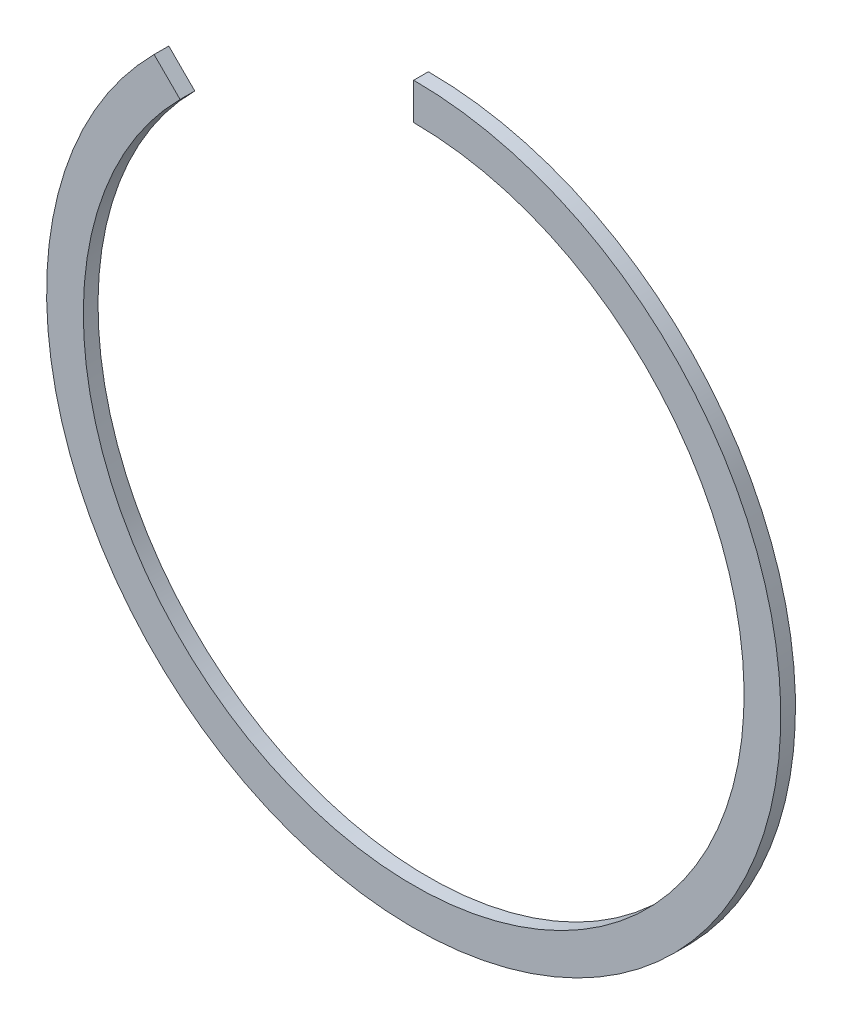
ISO-10303-21;
HEADER;
FILE_DESCRIPTION(('STEP AP214'),'2;1');
FILE_NAME('part.step','',(''),(''),'','','');
FILE_SCHEMA(('AUTOMOTIVE_DESIGN { 1 0 10303 214 1 1 1 1 }'));
ENDSEC;
DATA;
#1=APPLICATION_CONTEXT('core data for automotive mechanical design processes');
#2=APPLICATION_PROTOCOL_DEFINITION('international standard','automotive_design',2000,#1);
#3=PRODUCT_CONTEXT('',#1,'mechanical');
#4=PRODUCT('Part','Part','',(#3));
#5=PRODUCT_RELATED_PRODUCT_CATEGORY('part','',(#4));
#6=PRODUCT_DEFINITION_FORMATION('','',#4);
#7=PRODUCT_DEFINITION_CONTEXT('part definition',#1,'design');
#8=PRODUCT_DEFINITION('design','',#6,#7);
#9=PRODUCT_DEFINITION_SHAPE('','',#8);
#10=(LENGTH_UNIT() NAMED_UNIT(*) SI_UNIT(.MILLI.,.METRE.));
#11=(NAMED_UNIT(*) PLANE_ANGLE_UNIT() SI_UNIT($,.RADIAN.));
#12=(NAMED_UNIT(*) SI_UNIT($,.STERADIAN.) SOLID_ANGLE_UNIT());
#13=UNCERTAINTY_MEASURE_WITH_UNIT(LENGTH_MEASURE(1.E-05),#10,'distance_accuracy_value','');
#14=(GEOMETRIC_REPRESENTATION_CONTEXT(3) GLOBAL_UNCERTAINTY_ASSIGNED_CONTEXT((#13)) GLOBAL_UNIT_ASSIGNED_CONTEXT((#10,
#11,#12)) REPRESENTATION_CONTEXT('',''));
#15=CARTESIAN_POINT('',(0.,0.,0.));
#16=DIRECTION('',(0.,0.,1.));
#17=DIRECTION('',(1.,0.,0.));
#18=AXIS2_PLACEMENT_3D('',#15,#16,#17);
#19=CARTESIAN_POINT('',(0.,0.,1.));
#20=DIRECTION('',(0.,0.,-1.));
#21=DIRECTION('',(-1.,0.,0.));
#22=AXIS2_PLACEMENT_3D('',#19,#20,#21);
#23=CYLINDRICAL_SURFACE('',#22,22.5);
#24=CARTESIAN_POINT('',(0.,0.,0.));
#25=DIRECTION('',(0.,0.,1.));
#26=DIRECTION('',(1.,0.,0.));
#27=AXIS2_PLACEMENT_3D('',#24,#25,#26);
#28=CIRCLE('',#27,22.5);
#29=CARTESIAN_POINT('',(-15.9099025766973,15.9099025766973,0.));
#30=VERTEX_POINT('',#29);
#31=CARTESIAN_POINT('',(0.,22.5,0.));
#32=VERTEX_POINT('',#31);
#33=EDGE_CURVE('E112',#30,#32,#28,.T.);
#34=ORIENTED_EDGE('',*,*,#33,.F.);
#35=DIRECTION('',(0.,0.,-1.));
#36=VECTOR('',#35,1.);
#37=CARTESIAN_POINT('',(-15.9099025766973,15.9099025766973,1.));
#38=LINE('',#37,#36);
#39=CARTESIAN_POINT('',(-15.9099025766973,15.9099025766973,1.));
#40=VERTEX_POINT('',#39);
#41=EDGE_CURVE('E11',#40,#30,#38,.T.);
#42=ORIENTED_EDGE('',*,*,#41,.F.);
#43=CARTESIAN_POINT('',(0.,0.,1.));
#44=DIRECTION('',(0.,0.,1.));
#45=DIRECTION('',(1.,0.,0.));
#46=AXIS2_PLACEMENT_3D('',#43,#44,#45);
#47=CIRCLE('',#46,22.5);
#48=CARTESIAN_POINT('',(0.,22.5,1.));
#49=VERTEX_POINT('',#48);
#50=EDGE_CURVE('E103',#40,#49,#47,.T.);
#51=ORIENTED_EDGE('',*,*,#50,.T.);
#52=DIRECTION('',(0.,0.,-1.));
#53=VECTOR('',#52,1.);
#54=CARTESIAN_POINT('',(0.,22.5,1.));
#55=LINE('',#54,#53);
#56=EDGE_CURVE('E59',#49,#32,#55,.T.);
#57=ORIENTED_EDGE('',*,*,#56,.T.);
#58=EDGE_LOOP('',(#34,#42,#51,#57));
#59=FACE_BOUND('',#58,.T.);
#60=ADVANCED_FACE('F42',(#59),#23,.F.);
#61=CARTESIAN_POINT('',(0.,0.,1.));
#62=DIRECTION('',(0.707106781186547,0.707106781186547,0.));
#63=DIRECTION('',(-0.707106781186548,0.707106781186548,0.));
#64=AXIS2_PLACEMENT_3D('',#61,#62,#63);
#65=PLANE('',#64);
#66=DIRECTION('',(0.707106781186548,-0.707106781186548,0.));
#67=VECTOR('',#66,1.);
#68=CARTESIAN_POINT('',(0.,0.,0.));
#69=LINE('',#68,#67);
#70=CARTESIAN_POINT('',(-17.6776695296637,17.6776695296637,0.));
#71=VERTEX_POINT('',#70);
#72=EDGE_CURVE('E91',#71,#30,#69,.T.);
#73=ORIENTED_EDGE('',*,*,#72,.F.);
#74=DIRECTION('',(0.,0.,-1.));
#75=VECTOR('',#74,1.);
#76=CARTESIAN_POINT('',(-17.6776695296637,17.6776695296637,1.));
#77=LINE('',#76,#75);
#78=CARTESIAN_POINT('',(-17.6776695296637,17.6776695296637,1.));
#79=VERTEX_POINT('',#78);
#80=EDGE_CURVE('E51',#79,#71,#77,.T.);
#81=ORIENTED_EDGE('',*,*,#80,.F.);
#82=DIRECTION('',(0.707106781186548,-0.707106781186548,0.));
#83=VECTOR('',#82,1.);
#84=CARTESIAN_POINT('',(0.,0.,1.));
#85=LINE('',#84,#83);
#86=EDGE_CURVE('E89',#79,#40,#85,.T.);
#87=ORIENTED_EDGE('',*,*,#86,.T.);
#88=ORIENTED_EDGE('',*,*,#41,.T.);
#89=EDGE_LOOP('',(#73,#81,#87,#88));
#90=FACE_BOUND('',#89,.T.);
#91=ADVANCED_FACE('F87',(#90),#65,.T.);
#92=CARTESIAN_POINT('',(0.,0.,1.));
#93=DIRECTION('',(0.,0.,-1.));
#94=DIRECTION('',(-1.,0.,0.));
#95=AXIS2_PLACEMENT_3D('',#92,#93,#94);
#96=CYLINDRICAL_SURFACE('',#95,25.);
#97=CARTESIAN_POINT('',(0.,0.,0.));
#98=DIRECTION('',(0.,0.,1.));
#99=DIRECTION('',(1.,0.,0.));
#100=AXIS2_PLACEMENT_3D('',#97,#98,#99);
#101=CIRCLE('',#100,25.);
#102=CARTESIAN_POINT('',(0.,25.,0.));
#103=VERTEX_POINT('',#102);
#104=EDGE_CURVE('E117',#71,#103,#101,.T.);
#105=ORIENTED_EDGE('',*,*,#104,.T.);
#106=DIRECTION('',(0.,0.,-1.));
#107=VECTOR('',#106,1.);
#108=CARTESIAN_POINT('',(0.,25.,1.));
#109=LINE('',#108,#107);
#110=CARTESIAN_POINT('',(0.,25.,1.));
#111=VERTEX_POINT('',#110);
#112=EDGE_CURVE('E73',#111,#103,#109,.T.);
#113=ORIENTED_EDGE('',*,*,#112,.F.);
#114=CARTESIAN_POINT('',(0.,0.,1.));
#115=DIRECTION('',(0.,0.,1.));
#116=DIRECTION('',(1.,0.,0.));
#117=AXIS2_PLACEMENT_3D('',#114,#115,#116);
#118=CIRCLE('',#117,25.);
#119=EDGE_CURVE('E95',#79,#111,#118,.T.);
#120=ORIENTED_EDGE('',*,*,#119,.F.);
#121=ORIENTED_EDGE('',*,*,#80,.T.);
#122=EDGE_LOOP('',(#105,#113,#120,#121));
#123=FACE_BOUND('',#122,.T.);
#124=ADVANCED_FACE('F96',(#123),#96,.T.);
#125=CARTESIAN_POINT('',(0.,0.,1.));
#126=DIRECTION('',(-1.,0.,0.));
#127=DIRECTION('',(0.,0.,1.));
#128=AXIS2_PLACEMENT_3D('',#125,#126,#127);
#129=PLANE('',#128);
#130=DIRECTION('',(0.,1.,0.));
#131=VECTOR('',#130,1.);
#132=CARTESIAN_POINT('',(0.,0.,0.));
#133=LINE('',#132,#131);
#134=EDGE_CURVE('E107',#32,#103,#133,.T.);
#135=ORIENTED_EDGE('',*,*,#134,.F.);
#136=ORIENTED_EDGE('',*,*,#56,.F.);
#137=DIRECTION('',(0.,1.,0.));
#138=VECTOR('',#137,1.);
#139=CARTESIAN_POINT('',(0.,0.,1.));
#140=LINE('',#139,#138);
#141=EDGE_CURVE('E100',#49,#111,#140,.T.);
#142=ORIENTED_EDGE('',*,*,#141,.T.);
#143=ORIENTED_EDGE('',*,*,#112,.T.);
#144=EDGE_LOOP('',(#135,#136,#142,#143));
#145=FACE_BOUND('',#144,.T.);
#146=ADVANCED_FACE('F128',(#145),#129,.T.);
#147=CARTESIAN_POINT('',(0.,0.,1.));
#148=DIRECTION('',(0.,0.,1.));
#149=DIRECTION('',(1.,0.,0.));
#150=AXIS2_PLACEMENT_3D('',#147,#148,#149);
#151=PLANE('',#150);
#152=ORIENTED_EDGE('',*,*,#50,.F.);
#153=ORIENTED_EDGE('',*,*,#86,.F.);
#154=ORIENTED_EDGE('',*,*,#119,.T.);
#155=ORIENTED_EDGE('',*,*,#141,.F.);
#156=EDGE_LOOP('',(#152,#153,#154,#155));
#157=FACE_BOUND('',#156,.T.);
#158=ADVANCED_FACE('F102',(#157),#151,.T.);
#159=CARTESIAN_POINT('',(0.,0.,0.));
#160=DIRECTION('',(0.,0.,1.));
#161=DIRECTION('',(1.,0.,0.));
#162=AXIS2_PLACEMENT_3D('',#159,#160,#161);
#163=PLANE('',#162);
#164=ORIENTED_EDGE('',*,*,#33,.T.);
#165=ORIENTED_EDGE('',*,*,#134,.T.);
#166=ORIENTED_EDGE('',*,*,#104,.F.);
#167=ORIENTED_EDGE('',*,*,#72,.T.);
#168=EDGE_LOOP('',(#164,#165,#166,#167));
#169=FACE_BOUND('',#168,.T.);
#170=ADVANCED_FACE('F127',(#169),#163,.F.);
#171=CLOSED_SHELL('',(#60,#91,#124,#146,#158,#170));
#172=MANIFOLD_SOLID_BREP('B2',#171);
#173=ADVANCED_BREP_SHAPE_REPRESENTATION('',(#18,#172),#14);
#174=SHAPE_DEFINITION_REPRESENTATION(#9,#173);
ENDSEC;
END-ISO-10303-21;
